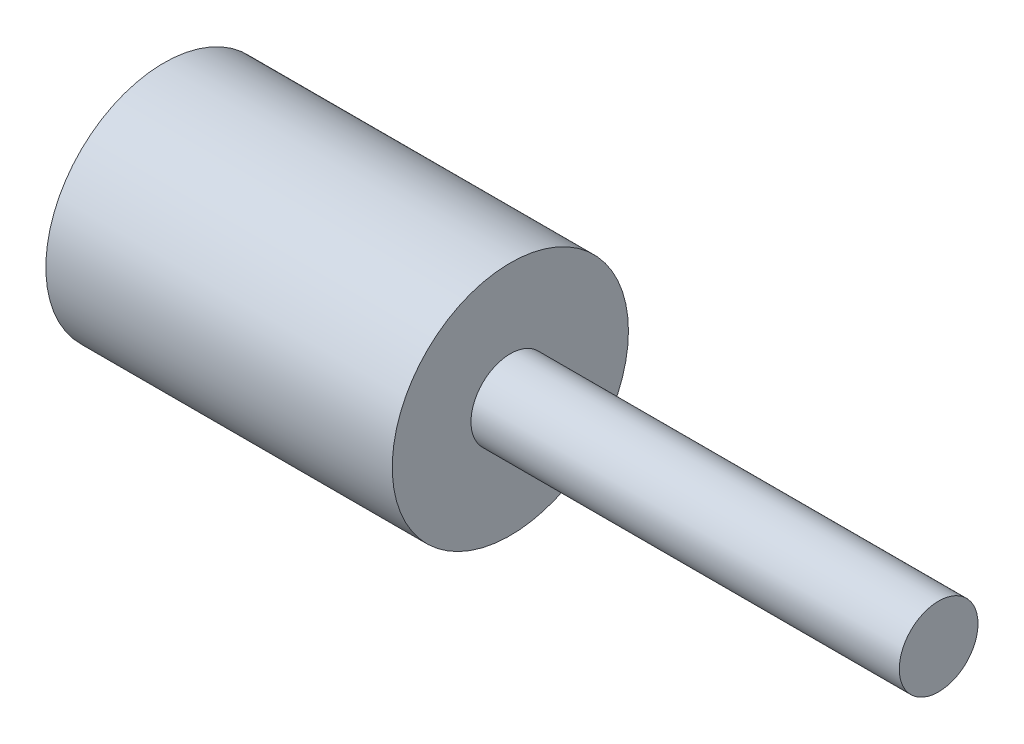
ISO-10303-21;
HEADER;
FILE_DESCRIPTION(('STEP AP214'),'2;1');
FILE_NAME('part.step','',(''),(''),'','','');
FILE_SCHEMA(('AUTOMOTIVE_DESIGN { 1 0 10303 214 1 1 1 1 }'));
ENDSEC;
DATA;
#1=APPLICATION_CONTEXT('core data for automotive mechanical design processes');
#2=APPLICATION_PROTOCOL_DEFINITION('international standard','automotive_design',2000,#1);
#3=PRODUCT_CONTEXT('',#1,'mechanical');
#4=PRODUCT('Part','Part','',(#3));
#5=PRODUCT_RELATED_PRODUCT_CATEGORY('part','',(#4));
#6=PRODUCT_DEFINITION_FORMATION('','',#4);
#7=PRODUCT_DEFINITION_CONTEXT('part definition',#1,'design');
#8=PRODUCT_DEFINITION('design','',#6,#7);
#9=PRODUCT_DEFINITION_SHAPE('','',#8);
#10=(LENGTH_UNIT() NAMED_UNIT(*) SI_UNIT(.MILLI.,.METRE.));
#11=(NAMED_UNIT(*) PLANE_ANGLE_UNIT() SI_UNIT($,.RADIAN.));
#12=(NAMED_UNIT(*) SI_UNIT($,.STERADIAN.) SOLID_ANGLE_UNIT());
#13=UNCERTAINTY_MEASURE_WITH_UNIT(LENGTH_MEASURE(1.E-05),#10,'distance_accuracy_value','');
#14=(GEOMETRIC_REPRESENTATION_CONTEXT(3) GLOBAL_UNCERTAINTY_ASSIGNED_CONTEXT((#13)) GLOBAL_UNIT_ASSIGNED_CONTEXT((#10,
#11,#12)) REPRESENTATION_CONTEXT('',''));
#15=CARTESIAN_POINT('',(0.,0.,0.));
#16=DIRECTION('',(0.,0.,1.));
#17=DIRECTION('',(1.,0.,0.));
#18=AXIS2_PLACEMENT_3D('',#15,#16,#17);
#19=CARTESIAN_POINT('',(0.,0.,0.));
#20=DIRECTION('',(1.,0.,0.));
#21=DIRECTION('',(0.,0.,-1.));
#22=AXIS2_PLACEMENT_3D('',#19,#20,#21);
#23=PLANE('',#22);
#24=CARTESIAN_POINT('',(0.,0.,0.));
#25=DIRECTION('',(-1.,0.,0.));
#26=DIRECTION('',(0.,0.,1.));
#27=AXIS2_PLACEMENT_3D('',#24,#25,#26);
#28=CIRCLE('',#27,3.75);
#29=CARTESIAN_POINT('',(0.,0.,3.75));
#30=VERTEX_POINT('',#29);
#31=EDGE_CURVE('E99',#30,#30,#28,.T.);
#32=ORIENTED_EDGE('',*,*,#31,.F.);
#33=EDGE_LOOP('',(#32));
#34=FACE_BOUND('',#33,.T.);
#35=CARTESIAN_POINT('',(0.,0.,0.));
#36=DIRECTION('',(1.,0.,0.));
#37=DIRECTION('',(0.,0.,-1.));
#38=AXIS2_PLACEMENT_3D('',#35,#36,#37);
#39=CIRCLE('',#38,7.5);
#40=CARTESIAN_POINT('',(0.,0.,-7.5));
#41=VERTEX_POINT('',#40);
#42=EDGE_CURVE('E58',#41,#41,#39,.T.);
#43=ORIENTED_EDGE('',*,*,#42,.F.);
#44=EDGE_LOOP('',(#43));
#45=FACE_BOUND('',#44,.T.);
#46=ADVANCED_FACE('F41',(#34,#45),#23,.F.);
#47=CARTESIAN_POINT('',(49.2,0.,0.));
#48=DIRECTION('',(1.,0.,0.));
#49=DIRECTION('',(0.,0.,-1.));
#50=AXIS2_PLACEMENT_3D('',#47,#48,#49);
#51=CYLINDRICAL_SURFACE('',#50,7.5);
#52=CARTESIAN_POINT('',(3.46134987512084,0.403773083988441,-6.97926672960183));
#53=CARTESIAN_POINT('',(3.47152983620495,0.440195317517897,-7.4883245853202));
#54=CARTESIAN_POINT('',(2.97980521968072,0.576818691412058,-7.47778578171625));
#55=CARTESIAN_POINT('',(3.43877449700653,0.323001466650791,-6.98757373392537));
#56=CARTESIAN_POINT('',(3.44506887639352,0.353339285616381,-7.49291141332811));
#57=CARTESIAN_POINT('',(2.9497047155297,0.46143066664979,-7.48668614352733));
#58=CARTESIAN_POINT('',(3.42295612892248,0.240203439208041,-6.99355934643733));
#59=CARTESIAN_POINT('',(3.42617985694261,0.262924802296811,-7.49632916883528));
#60=CARTESIAN_POINT('',(2.9286135580812,0.343147770298765,-7.49309929975168));
#61=CARTESIAN_POINT('',(3.405407400726,0.0730157462910324,-7.00021029863759));
#62=CARTESIAN_POINT('',(3.40532558215163,0.080196448081362,-7.50011196833271));
#63=CARTESIAN_POINT('',(2.90521525381891,0.104308208985412,-7.5002253199502));
#64=CARTESIAN_POINT('',(3.40367407032254,-0.0113735798432147,-7.00087676004241));
#65=CARTESIAN_POINT('',(3.40324494178492,-0.0125971332762231,-7.5004978816679));
#66=CARTESIAN_POINT('',(2.90290414661708,-0.0162479712054712,-7.50093938576348));
#67=CARTESIAN_POINT('',(3.41418347331524,-0.176539193620047,-6.99688149083974));
#68=CARTESIAN_POINT('',(3.4157449882851,-0.193342811341342,-7.49821980810748));
#69=CARTESIAN_POINT('',(2.91691668393919,-0.252198848027788,-7.4966587401818));
#70=CARTESIAN_POINT('',(3.42599080862015,-0.25734593662656,-6.99238574454701));
#71=CARTESIAN_POINT('',(3.42986984563603,-0.281816449608304,-7.49563928331543));
#72=CARTESIAN_POINT('',(2.93265979767499,-0.367637052321973,-7.49184186912569));
#73=CARTESIAN_POINT('',(3.4624664732951,-0.41577139007139,-6.9788172142623));
#74=CARTESIAN_POINT('',(3.4729569622573,-0.453658648730667,-7.48804426222132));
#75=CARTESIAN_POINT('',(2.98129401724354,-0.593959128674158,-7.47730415812591));
#76=CARTESIAN_POINT('',(3.48713529218839,-0.493389979043487,-6.96974425605665));
#77=CARTESIAN_POINT('',(3.5021241894842,-0.537397046841379,-7.48299489941553));
#78=CARTESIAN_POINT('',(3.01418577577395,-0.704842827208989,-7.46758313152475));
#79=CARTESIAN_POINT('',(3.54872182715635,-0.643804100672505,-6.94790496305974));
#80=CARTESIAN_POINT('',(3.57375522146097,-0.697415192570807,-7.47126581270006));
#81=CARTESIAN_POINT('',(3.0963011557249,-0.919720143813833,-7.44418388895689));
#82=CARTESIAN_POINT('',(3.58570908252885,-0.716569370910425,-6.93511771419894));
#83=CARTESIAN_POINT('',(3.6165870463601,-0.773871949250063,-7.46453532131574));
#84=CARTESIAN_POINT('',(3.14561749620911,-1.02367052985662,-7.4304832650576));
#85=CARTESIAN_POINT('',(3.67089938400283,-0.855098312739958,-6.90715960251651));
#86=CARTESIAN_POINT('',(3.71322425922761,-0.916708407017081,-7.45050184454463));
#87=CARTESIAN_POINT('',(3.25920456484105,-1.22156901819701,-7.40052814545155));
#88=CARTESIAN_POINT('',(3.71912356339666,-0.920848446989794,-6.89198426609542));
#89=CARTESIAN_POINT('',(3.76735234554158,-0.983112925473451,-7.44316955398783));
#90=CARTESIAN_POINT('',(3.32350347071197,-1.315497781435,-7.38426885660307));
#91=CARTESIAN_POINT('',(3.82736545152009,-1.04577668187678,-6.86026101019536));
#92=CARTESIAN_POINT('',(3.88588659677426,-1.10636636122893,-7.42874030796069));
#93=CARTESIAN_POINT('',(3.46782598821636,-1.49396668837366,-7.35027965370595));
#94=CARTESIAN_POINT('',(3.88773641751494,-1.10464480333838,-6.84368365641372));
#95=CARTESIAN_POINT('',(3.95079005915509,-1.16262007831212,-7.42166449524396));
#96=CARTESIAN_POINT('',(3.54832060953615,-1.5780640046775,-7.33251820288693));
#97=CARTESIAN_POINT('',(4.01744533019716,-1.21142242713965,-6.81148761163437));
#98=CARTESIAN_POINT('',(4.08612301138476,-1.26178375653622,-7.4089424163596));
#99=CARTESIAN_POINT('',(3.7212658264439,-1.73060346727782,-7.29802244071021));
#100=CARTESIAN_POINT('',(4.08676781278456,-1.25935044267418,-6.79586733431742));
#101=CARTESIAN_POINT('',(4.15660715794053,-1.30442909767297,-7.40332515297504));
#102=CARTESIAN_POINT('',(3.81369580323187,-1.79907206099525,-7.28128642972347));
#103=CARTESIAN_POINT('',(4.23369485141015,-1.34361210105492,-6.76712719198057));
#104=CARTESIAN_POINT('',(4.30138111605005,-1.37724618441168,-7.3938521886502));
#105=CARTESIAN_POINT('',(4.0095985214003,-1.91944585861732,-7.2504934198802));
#106=CARTESIAN_POINT('',(4.3113988109308,-1.3797800232983,-6.75404403400623));
#107=CARTESIAN_POINT('',(4.37552052664015,-1.40687969789514,-7.39007097161584));
#108=CARTESIAN_POINT('',(4.11320380075726,-1.97111431880011,-7.23647574998684));
#109=CARTESIAN_POINT('',(4.47213244157208,-1.43843191179064,-6.73225726297903));
#110=CARTESIAN_POINT('',(4.52463366294648,-1.45383857106162,-7.38426960936252));
#111=CARTESIAN_POINT('',(4.32751530827815,-2.05490273098916,-7.21313278120466));
#112=CARTESIAN_POINT('',(4.55516066276566,-1.46091958616028,-6.7235524632544));
#113=CARTESIAN_POINT('',(4.59921153608436,-1.47086412896918,-7.38228985281925));
#114=CARTESIAN_POINT('',(4.438219603206,-2.08702798031057,-7.20380621088142));
#115=CARTESIAN_POINT('',(4.72139737196173,-1.4909177676606,-6.7118340687022));
#116=CARTESIAN_POINT('',(4.74616230808021,-1.49343890783981,-7.37972369281712));
#117=CARTESIAN_POINT('',(4.65986854880302,-2.1298825251504,-7.19125078765142));
#118=CARTESIAN_POINT('',(4.80451808622033,-1.498877016215,-6.70865011357494));
#119=CARTESIAN_POINT('',(4.81804757427088,-1.49917566025195,-7.37911387962899));
#120=CARTESIAN_POINT('',(4.77069616781381,-2.14125287986435,-7.1878394059179));
#121=CARTESIAN_POINT('',(4.97093622632783,-1.50090077130773,-6.70784608547526));
#122=CARTESIAN_POINT('',(4.96231307288287,-1.50066177437418,-7.37895240145396));
#123=CARTESIAN_POINT('',(4.99258702128962,-2.14414395856475,-7.18697794722466));
#124=CARTESIAN_POINT('',(5.05423362190804,-1.49496749170627,-6.71022512600501));
#125=CARTESIAN_POINT('',(5.03415482641791,-1.4964017987924,-7.37940174077361));
#126=CARTESIAN_POINT('',(5.10365021539641,-2.13566784520851,-7.18952692044548));
#127=CARTESIAN_POINT('',(5.21629934966673,-1.46977915416084,-6.72010723018086));
#128=CARTESIAN_POINT('',(5.17674848576788,-1.4775573057072,-7.38152146207214));
#129=CARTESIAN_POINT('',(5.31973785240914,-2.09968450602789,-7.20011488974631));
#130=CARTESIAN_POINT('',(5.29512923543433,-1.45088587330038,-6.72747107189395));
#131=CARTESIAN_POINT('',(5.24699451894075,-1.46338099767762,-7.383143980374));
#132=CARTESIAN_POINT('',(5.42484436676723,-2.07269410462302,-7.20800471951987));
#133=CARTESIAN_POINT('',(5.44847713787974,-1.40078895931244,-6.74631916672708));
#134=CARTESIAN_POINT('',(5.38768175528546,-1.42384190152081,-7.38795049900001));
#135=CARTESIAN_POINT('',(5.62930823669397,-2.00112708462114,-7.22819910681827));
#136=CARTESIAN_POINT('',(5.52299464586162,-1.36958387724292,-6.75780390480966));
#137=CARTESIAN_POINT('',(5.45776187012501,-1.39871359056947,-7.39110358663529));
#138=CARTESIAN_POINT('',(5.72866491400138,-1.95654839610699,-7.24050418394598));
#139=CARTESIAN_POINT('',(5.66732242836437,-1.29502786636653,-6.78389102394226));
#140=CARTESIAN_POINT('',(5.59771901818369,-1.33557060970359,-7.39925478374181));
#141=CARTESIAN_POINT('',(5.92110195733916,-1.85003980904843,-7.26845466828365));
#142=CARTESIAN_POINT('',(5.73700393338249,-1.25143972647923,-6.79855281536143));
#143=CARTESIAN_POINT('',(5.66737951219626,-1.29759992619566,-7.404247966099));
#144=CARTESIAN_POINT('',(6.01401063069929,-1.78777103752356,-7.28416372942589));
#145=CARTESIAN_POINT('',(5.86823857976657,-1.15358945930719,-6.82925109369181));
#146=CARTESIAN_POINT('',(5.80217796990056,-1.20849643263408,-7.41581114985628));
#147=CARTESIAN_POINT('',(6.1889901592106,-1.64798494154493,-7.31705474186557));
#148=CARTESIAN_POINT('',(5.92978965933615,-1.09932463317136,-6.84528792760657));
#149=CARTESIAN_POINT('',(5.86731448779159,-1.15765083799326,-7.4223462050117));
#150=CARTESIAN_POINT('',(6.27105826529993,-1.57046376158976,-7.33423706495304));
#151=CARTESIAN_POINT('',(6.04530535918744,-0.979350109426314,-6.87762821964431));
#152=CARTESIAN_POINT('',(5.99200450972688,-1.04137965426748,-7.4364799225086));
#153=CARTESIAN_POINT('',(6.42507919843745,-1.39907158498134,-7.36888737854225));
#154=CARTESIAN_POINT('',(6.09891816253803,-0.913299392863548,-6.89392057116443));
#155=CARTESIAN_POINT('',(6.05151261565454,-0.975656026539498,-7.44410262222523));
#156=CARTESIAN_POINT('',(6.49656293624449,-1.30471341838311,-7.38634346906142));
#157=CARTESIAN_POINT('',(6.19431639396918,-0.772913732750899,-6.92437231629141));
#158=CARTESIAN_POINT('',(6.15877226489862,-0.832496558526676,-7.45902012866418));
#159=CARTESIAN_POINT('',(6.62376057815099,-1.1041624753177,-7.41897033865764));
#160=CARTESIAN_POINT('',(6.23610584823674,-0.698581621298607,-6.93853243521396));
#161=CARTESIAN_POINT('',(6.20685633210501,-0.755071577931056,-7.46633949350619));
#162=CARTESIAN_POINT('',(6.6794798504998,-0.997973744704204,-7.43414189485844));
#163=CARTESIAN_POINT('',(6.30322393981883,-0.551042933543503,-6.96197074265609));
#164=CARTESIAN_POINT('',(6.28457929780659,-0.599004858949693,-7.47876683936898));
#165=CARTESIAN_POINT('',(6.76897063927997,-0.78720419078375,-7.45925436714389));
#166=CARTESIAN_POINT('',(6.32974320984513,-0.478406418422231,-6.97158594877815));
#167=CARTESIAN_POINT('',(6.31577086653685,-0.521104985025631,-7.48404863560761));
#168=CARTESIAN_POINT('',(6.80432966599185,-0.683437740597744,-7.46955637355303));
#169=CARTESIAN_POINT('',(6.37133210857514,-0.329713047905585,-6.9868885260037));
#170=CARTESIAN_POINT('',(6.36472544629955,-0.360530222381673,-7.49253476525729));
#171=CARTESIAN_POINT('',(6.85978153096591,-0.471018639854545,-7.48595199198059));
#172=CARTESIAN_POINT('',(6.38640503626451,-0.253657184709832,-6.99257702879144));
#173=CARTESIAN_POINT('',(6.3826947089233,-0.277570457823199,-7.49577284357025));
#174=CARTESIAN_POINT('',(6.87987876787563,-0.362367406725377,-7.49204681651777));
#175=CARTESIAN_POINT('',(6.40516089149755,-0.095646649482302,-6.9996751084977));
#176=CARTESIAN_POINT('',(6.40496992958709,-0.10498487274874,-7.49980439783524));
#177=CARTESIAN_POINT('',(6.90488657484614,-0.136638070692125,-7.49965190200882));
#178=CARTESIAN_POINT('',(6.40815028880822,-0.0136018723438183,-7.0008240607918));
#179=CARTESIAN_POINT('',(6.40855797944524,-0.014804999726994,-7.50046947879871));
#180=CARTESIAN_POINT('',(6.90887243793031,-0.0194312462064873,-7.50088292228468));
#181=CARTESIAN_POINT('',(6.40072242656992,0.14983779665546,-6.99799746258956));
#182=CARTESIAN_POINT('',(6.39971953420929,0.164123160015132,-7.49885623836998));
#183=CARTESIAN_POINT('',(6.89896862161381,0.214053995223092,-7.49785442419051));
#184=CARTESIAN_POINT('',(6.39030253782012,0.231232557916645,-6.99402090711857));
#185=CARTESIAN_POINT('',(6.38724447577014,0.253328727982139,-7.49656902008685));
#186=CARTESIAN_POINT('',(6.88507543661204,0.330332225596162,-7.49359382906195));
#187=CARTESIAN_POINT('',(6.35643461043415,0.390963704597379,-6.98137791030673));
#188=CARTESIAN_POINT('',(6.34719256790881,0.426835318892558,-7.48947073031346));
#189=CARTESIAN_POINT('',(6.83991820009952,0.558519577995302,-7.48004776103661));
#190=CARTESIAN_POINT('',(6.33299852210559,0.46930282492906,-6.97271577103859));
#191=CARTESIAN_POINT('',(6.3194359292793,0.511527777056255,-7.48462863590922));
#192=CARTESIAN_POINT('',(6.80867008233226,0.670432607038705,-7.4707668975035));
#193=CARTESIAN_POINT('',(6.27386883209658,0.620897077805399,-6.95161715450192));
#194=CARTESIAN_POINT('',(6.25052566949979,0.673204156691916,-7.47323623028241));
#195=CARTESIAN_POINT('',(6.7298304956522,0.886995825437211,-7.44816123695));
#196=CARTESIAN_POINT('',(6.23817380354004,0.694151617337956,-6.93918023788879));
#197=CARTESIAN_POINT('',(6.20908221341455,0.75043148897809,-7.4666436538453));
#198=CARTESIAN_POINT('',(6.68223712423797,0.991645167632169,-7.43483596920326));
#199=CARTESIAN_POINT('',(6.15487207880235,0.834912543342262,-6.91157758280352));
#200=CARTESIAN_POINT('',(6.11428602015337,0.896144022990652,-7.45267045273865));
#201=CARTESIAN_POINT('',(6.57116815792445,1.19273220476803,-7.4052616958236));
#202=CARTESIAN_POINT('',(6.10707514025101,0.902301531469412,-6.89636946697742));
#203=CARTESIAN_POINT('',(6.06043956694273,0.964510056610677,-7.44524845827971));
#204=CARTESIAN_POINT('',(6.50743890653184,1.28900218778767,-7.3889672858798));
#205=CARTESIAN_POINT('',(6.00107562919479,1.02838313066046,-6.86492612961224));
#206=CARTESIAN_POINT('',(5.94396125604524,1.08944636818923,-7.43079901014567));
#207=CARTESIAN_POINT('',(6.36610622512262,1.46911875809428,-7.35527799598452));
#208=CARTESIAN_POINT('',(5.942853460291,1.08705897687362,-6.84868901164034));
#209=CARTESIAN_POINT('',(5.88107241181672,1.14587177978595,-7.42376909386538));
#210=CARTESIAN_POINT('',(6.2884766665741,1.55294139559461,-7.33788108414149));
#211=CARTESIAN_POINT('',(5.81552761293025,1.19580797751441,-6.81641800998019));
#212=CARTESIAN_POINT('',(5.74742740309236,1.24761933038846,-7.4107939512927));
#213=CARTESIAN_POINT('',(6.11870887009345,1.70829711067209,-7.30330501044433));
#214=CARTESIAN_POINT('',(5.74613897379631,1.24555198729488,-6.80040663334589));
#215=CARTESIAN_POINT('',(5.67643879960561,1.2922218849899,-7.40492311490899));
#216=CARTESIAN_POINT('',(6.02619068459268,1.77935998160318,-7.28614996325818));
#217=CARTESIAN_POINT('',(5.59983463744265,1.3325918882926,-6.77101262654863));
#218=CARTESIAN_POINT('',(5.53147254683339,1.3679747517278,-7.39505061369276));
#219=CARTESIAN_POINT('',(5.83111823612249,1.90370269737297,-7.25465638474262));
#220=CARTESIAN_POINT('',(5.52293344402584,1.36991117566484,-6.7576250754243));
#221=CARTESIAN_POINT('',(5.45764742132273,1.39879889490985,-7.39109336118354));
#222=CARTESIAN_POINT('',(5.728583311557,1.95701596528944,-7.24031258095124));
#223=CARTESIAN_POINT('',(5.36424416676344,1.4307894739841,-6.73515988184305));
#224=CARTESIAN_POINT('',(5.30962330180038,1.44787899318086,-7.38498666646117));
#225=CARTESIAN_POINT('',(5.5169976085346,2.04398496278091,-7.21624273040777));
#226=CARTESIAN_POINT('',(5.28250108302531,1.45445828936135,-6.72604796023789));
#227=CARTESIAN_POINT('',(5.23579056163188,1.46593415780733,-7.38286373295237));
#228=CARTESIAN_POINT('',(5.40800683022087,2.07779755583249,-7.20647995601513));
#229=CARTESIAN_POINT('',(5.11597090335959,1.48765195750029,-6.71313107111684));
#230=CARTESIAN_POINT('',(5.08797051446145,1.49105097546566,-7.37998402983609));
#231=CARTESIAN_POINT('',(5.18596659066847,2.12521708175815,-7.19264043197298));
#232=CARTESIAN_POINT('',(5.03118472483841,1.49718103691142,-6.7093245177411));
#233=CARTESIAN_POINT('',(5.01449818155861,1.4979336301507,-7.37924866069997));
#234=CARTESIAN_POINT('',(5.07291835263835,2.13883005270265,-7.18856198318716));
#235=CARTESIAN_POINT('',(4.86441796828901,1.5016546292142,-6.70754611404688));
#236=CARTESIAN_POINT('',(4.86987943722958,1.50121424359729,-7.3788924346538));
#237=CARTESIAN_POINT('',(4.85056267723745,2.14522089890431,-7.18665655086734));
#238=CARTESIAN_POINT('',(4.78245266042651,1.49713749932653,-6.70935888039265));
#239=CARTESIAN_POINT('',(4.79926797746296,1.4979752216939,-7.37923302124946));
#240=CARTESIAN_POINT('',(4.74127560008755,2.13876785592975,-7.18859879955921));
#241=CARTESIAN_POINT('',(4.62050890066015,1.47485072277891,-6.7181277570376));
#242=CARTESIAN_POINT('',(4.65723406700027,1.48137265993141,-7.38108729201014));
#243=CARTESIAN_POINT('',(4.52535058706632,2.10692960367136,-7.19799402437345));
#244=CARTESIAN_POINT('',(4.54053043061451,1.45708119717238,-6.72508382035557));
#245=CARTESIAN_POINT('',(4.58629751090624,1.46812417347889,-7.38258788045781));
#246=CARTESIAN_POINT('',(4.41871262700593,2.08154456732099,-7.20544695015878));
#247=CARTESIAN_POINT('',(4.38528556798001,1.40905477872059,-6.74325037872784));
#248=CARTESIAN_POINT('',(4.44456372903451,1.43045336213842,-7.3871326870392));
#249=CARTESIAN_POINT('',(4.21171947682598,2.01293539823995,-7.22491112028632));
#250=CARTESIAN_POINT('',(4.30999228850708,1.3788785518485,-6.75443335401394));
#251=CARTESIAN_POINT('',(4.37415380256314,1.40633454179025,-7.39013679017248));
#252=CARTESIAN_POINT('',(4.11132843752768,1.9698265026159,-7.23689287916998));
#253=CARTESIAN_POINT('',(4.16545917695036,1.3069591948707,-6.77980475037368));
#254=CARTESIAN_POINT('',(4.23473441189285,1.34583289628075,-7.3979178058241));
#255=CARTESIAN_POINT('',(3.91861762211881,1.86708456406708,-7.26407651814472));
#256=CARTESIAN_POINT('',(4.09622052845185,1.2652138097964,-6.79399375723204));
#257=CARTESIAN_POINT('',(4.16594062957897,1.3097425955795,-7.40265407500552));
#258=CARTESIAN_POINT('',(3.82629942412196,1.80744829975866,-7.27927902586241));
#259=CARTESIAN_POINT('',(3.96314981915323,1.1696189413246,-6.82439850494452));
#260=CARTESIAN_POINT('',(4.03010593061681,1.2233658355142,-7.41389441103495));
#261=CARTESIAN_POINT('',(3.64887181172401,1.67088420184103,-7.31185554074632));
#262=CARTESIAN_POINT('',(3.89959277817712,1.11539608315876,-6.84066789773098));
#263=CARTESIAN_POINT('',(3.96319107819176,1.17290634350346,-7.42041967902785));
#264=CARTESIAN_POINT('',(3.56412909042151,1.59342297569611,-7.32928703208105));
#265=CARTESIAN_POINT('',(3.7823244860172,0.997158108817584,-6.87304720449928));
#266=CARTESIAN_POINT('',(3.83709017082043,1.05887101263225,-7.43440702104536));
#267=CARTESIAN_POINT('',(3.40777136754251,1.42451158377193,-7.36397914644961));
#268=CARTESIAN_POINT('',(3.72861391002669,0.93314232167179,-6.88915710747295));
#269=CARTESIAN_POINT('',(3.77772844844825,0.995499782670459,-7.44185614685384));
#270=CARTESIAN_POINT('',(3.33615726622373,1.33306045946345,-7.38123975768911));
#271=CARTESIAN_POINT('',(3.63136096840456,0.795364181890176,-6.91984268499218));
#272=CARTESIAN_POINT('',(3.66880349059903,0.855670379961934,-7.45673432936426));
#273=CARTESIAN_POINT('',(3.20648667739043,1.1362345456266,-7.41411716281643));
#274=CARTESIAN_POINT('',(3.58807633320247,0.721413984048024,-6.9343753686438));
#275=CARTESIAN_POINT('',(3.61915052934727,0.778950685597143,-7.46418315855112));
#276=CARTESIAN_POINT('',(3.14877383044842,1.03059140579807,-7.42968789500504));
#277=CARTESIAN_POINT('',(3.51462130479832,0.566939936672599,-6.9598372829941));
#278=CARTESIAN_POINT('',(3.53434698266023,0.616126492957936,-7.47758846467587));
#279=CARTESIAN_POINT('',(3.05083379257647,0.809914195224183,-7.45696851734251));
#280=CARTESIAN_POINT('',(3.4844486206546,0.486417238420153,-6.97076714310339));
#281=CARTESIAN_POINT('',(3.49883689468853,0.529828602163946,-7.48359109184306));
#282=CARTESIAN_POINT('',(3.01060354705765,0.694881769165711,-7.46867908185981));
#283=CARTESIAN_POINT('',(3.46134987512084,0.403773083988441,-6.97926672960183));
#284=CARTESIAN_POINT('',(3.47152983620495,0.440195317517897,-7.4883245853202));
#285=CARTESIAN_POINT('',(2.97980521968072,0.576818691412058,-7.47778578171625));
#286=(BOUNDED_SURFACE() B_SPLINE_SURFACE(3,2,((#52,#53,#54),(#55,#56,#57),(#58,#59,#60),(#61,
#62,#63),(#64,#65,#66),(#67,#68,#69),(#70,#71,#72),(#73,#74,#75),(#76,#77,#78),(#79,#80,#81),
(#82,#83,#84),(#85,#86,#87),(#88,#89,#90),(#91,#92,#93),(#94,#95,#96),(#97,#98,#99),(#100,#101,
#102),(#103,#104,#105),(#106,#107,#108),(#109,#110,#111),(#112,#113,#114),(#115,#116,#117),
(#118,#119,#120),(#121,#122,#123),(#124,#125,#126),(#127,#128,#129),(#130,#131,#132),(#133,#134,
#135),(#136,#137,#138),(#139,#140,#141),(#142,#143,#144),(#145,#146,#147),(#148,#149,#150),
(#151,#152,#153),(#154,#155,#156),(#157,#158,#159),(#160,#161,#162),(#163,#164,#165),(#166,#167,
#168),(#169,#170,#171),(#172,#173,#174),(#175,#176,#177),(#178,#179,#180),(#181,#182,#183),
(#184,#185,#186),(#187,#188,#189),(#190,#191,#192),(#193,#194,#195),(#196,#197,#198),(#199,#200,
#201),(#202,#203,#204),(#205,#206,#207),(#208,#209,#210),(#211,#212,#213),(#214,#215,#216),
(#217,#218,#219),(#220,#221,#222),(#223,#224,#225),(#226,#227,#228),(#229,#230,#231),(#232,#233,
#234),(#235,#236,#237),(#238,#239,#240),(#241,#242,#243),(#244,#245,#246),(#247,#248,#249),
(#250,#251,#252),(#253,#254,#255),(#256,#257,#258),(#259,#260,#261),(#262,#263,#264),(#265,#266,
#267),(#268,#269,#270),(#271,#272,#273),(#274,#275,#276),(#277,#278,#279),(#280,#281,#282),
(#283,#284,#285)),.UNSPECIFIED.,.T.,.F.,.F.) B_SPLINE_SURFACE_WITH_KNOTS((4,2,2,2,2,2,2,2,2,2,2,
2,2,2,2,2,2,2,2,2,2,2,2,2,2,2,2,2,2,2,2,2,2,2,2,2,2,2,4),(3,3),(0.,0.335972677373809,
0.671874502077117,0.997271188304442,1.32268026041788,1.64995836105771,1.97785701393945,
2.31721492163881,2.65599422787945,2.99935918892728,3.34263103713858,3.67510819733212,
4.00753237884177,4.33103560394491,4.65457691261468,4.98479058563269,5.31508783750179,
5.6572464854281,5.99928847796977,6.30867534354598,6.61797300590094,6.94479035813444,
7.27167180023674,7.59825362403425,7.92487347312605,8.2569866621099,8.58973080902533,
8.93295473940566,9.27552866351924,9.61530704109764,9.9549838316588,10.2818042734196,
10.6086217298902,10.9333470667057,11.2581357409776,11.5943227859018,11.9305328752789,
12.2743545406397,12.6181161087366),(0.,1.),
.UNSPECIFIED.) GEOMETRIC_REPRESENTATION_ITEM() RATIONAL_B_SPLINE_SURFACE(((1.,0.699749038761322,
1.),(1.,0.702708213278115,1.),(1.,0.704827681155372,1.),(1.,0.707181890820702,1.),(1.,
0.707417029980992,1.),(1.,0.706003797529279,1.),(1.,0.704414101657895,1.),(1.,0.699591801296326,
1.),(1.,0.696359134272836,1.),(1.,0.688520434209467,1.),(1.,0.683906619709923,1.),(1.,
0.673725790179998,1.),(1.,0.668156984372981,1.),(1.,0.656394834618455,1.),(1.,0.650186465949436,
1.),(1.,0.637997504153692,1.),(1.,0.632016540719849,1.),(1.,0.62090605341366,1.),(1.,
0.615789150293951,1.),(1.,0.607209544849037,1.),(1.,0.603746394318152,1.),(1.,0.599071886402445,
1.),(1.,0.597793142713117,1.),(1.,0.59747087744571,1.),(1.,0.598426999727887,1.),(1.,
0.602373740628683,1.),(1.,0.605309072799963,1.),(1.,0.612754721166151,1.),(1.,0.617265222731234,
1.),(1.,0.627401994853102,1.),(1.,0.633049357480188,1.),(1.,0.644742254655258,1.),(1.,
0.650787889620908,1.),(1.,0.662855199594238,1.),(1.,0.668868217598646,1.),(1.,0.680009865316591,
1.),(1.,0.685138795854043,1.),(1.,0.693576847723799,1.),(1.,0.69701295942503,1.),(1.,
0.702464106863337,1.),(1.,0.704479552043066,1.),(1.,0.706992834223862,1.),(1.,0.707398242127431,
1.),(1.,0.706398621980515,1.),(1.,0.704993238882486,1.),(1.,0.700503268613822,1.),(1.,
0.697420221776077,1.),(1.,0.689856754106516,1.),(1.,0.685376170614368,1.),(1.,0.675341761729412,
1.),(1.,0.669771153167102,1.),(1.,0.658133432474402,1.),(1.,0.652065397178893,1.),(1.,
0.639875978003496,1.),(1.,0.633758933013168,1.),(1.,0.622417531233502,1.),(1.,0.617191505787637,
1.),(1.,0.608358600515998,1.),(1.,0.604738855798322,1.),(1.,0.599591618523584,1.),(1.,
0.598063500748056,1.),(1.,0.597350617193482,1.),(1.,0.598079347496791,1.),(1.,0.6015842563818,
1.),(1.,0.604360416261342,1.),(1.,0.611546450289937,1.),(1.,0.615945752463985,1.),(1.,
0.625821436693709,1.),(1.,0.631298028665717,1.),(1.,0.642904921809186,1.),(1.,0.649051419538211,
1.),(1.,0.661155513983321,1.),(1.,0.667113097722018,1.),(1.,0.678361802612456,1.),(1.,
0.683634781988757,1.),(1.,0.692814392041374,1.),(1.,0.696721261383362,1.),(1.,0.699749038761322,1.))) REPRESENTATION_ITEM('') SURFACE());
#287=CARTESIAN_POINT('',(2.97980521968072,0.576818691412058,-7.47778578171625));
#288=CARTESIAN_POINT('',(2.9497047155297,0.46143066664979,-7.48668614352733));
#289=CARTESIAN_POINT('',(2.9286135580812,0.343147770298765,-7.49309929975168));
#290=CARTESIAN_POINT('',(2.90521525381891,0.104308208985412,-7.5002253199502));
#291=CARTESIAN_POINT('',(2.90290414661708,-0.0162479712054713,-7.50093938576348));
#292=CARTESIAN_POINT('',(2.91691668393919,-0.252198848027788,-7.4966587401818));
#293=CARTESIAN_POINT('',(2.93265979767499,-0.367637052321973,-7.49184186912569));
#294=CARTESIAN_POINT('',(2.98129401724354,-0.593959128674158,-7.47730415812591));
#295=CARTESIAN_POINT('',(3.01418577577395,-0.704842827208989,-7.46758313152475));
#296=CARTESIAN_POINT('',(3.0963011557249,-0.919720143813833,-7.44418388895689));
#297=CARTESIAN_POINT('',(3.14561749620911,-1.02367052985662,-7.4304832650576));
#298=CARTESIAN_POINT('',(3.25920456484105,-1.22156901819701,-7.40052814545155));
#299=CARTESIAN_POINT('',(3.32350347071197,-1.315497781435,-7.38426885660307));
#300=CARTESIAN_POINT('',(3.46782598821636,-1.49396668837366,-7.35027965370595));
#301=CARTESIAN_POINT('',(3.54832060953615,-1.5780640046775,-7.33251820288693));
#302=CARTESIAN_POINT('',(3.7212658264439,-1.73060346727782,-7.29802244071021));
#303=CARTESIAN_POINT('',(3.81369580323187,-1.79907206099525,-7.28128642972347));
#304=CARTESIAN_POINT('',(4.0095985214003,-1.91944585861732,-7.2504934198802));
#305=CARTESIAN_POINT('',(4.11320380075726,-1.97111431880011,-7.23647574998684));
#306=CARTESIAN_POINT('',(4.32751530827815,-2.05490273098916,-7.21313278120466));
#307=CARTESIAN_POINT('',(4.438219603206,-2.08702798031057,-7.20380621088142));
#308=CARTESIAN_POINT('',(4.65986854880302,-2.1298825251504,-7.19125078765143));
#309=CARTESIAN_POINT('',(4.77069616781381,-2.14125287986435,-7.1878394059179));
#310=CARTESIAN_POINT('',(4.99258702128962,-2.14414395856475,-7.18697794722466));
#311=CARTESIAN_POINT('',(5.10365021539641,-2.13566784520851,-7.18952692044548));
#312=CARTESIAN_POINT('',(5.31973785240914,-2.09968450602789,-7.20011488974631));
#313=CARTESIAN_POINT('',(5.42484436676723,-2.07269410462302,-7.20800471951987));
#314=CARTESIAN_POINT('',(5.62930823669397,-2.00112708462114,-7.22819910681827));
#315=CARTESIAN_POINT('',(5.72866491400138,-1.95654839610699,-7.24050418394598));
#316=CARTESIAN_POINT('',(5.92110195733916,-1.85003980904843,-7.26845466828365));
#317=CARTESIAN_POINT('',(6.01401063069929,-1.78777103752356,-7.28416372942589));
#318=CARTESIAN_POINT('',(6.1889901592106,-1.64798494154493,-7.31705474186557));
#319=CARTESIAN_POINT('',(6.27105826529993,-1.57046376158976,-7.33423706495304));
#320=CARTESIAN_POINT('',(6.42507919843745,-1.39907158498134,-7.36888737854225));
#321=CARTESIAN_POINT('',(6.49656293624449,-1.30471341838311,-7.38634346906142));
#322=CARTESIAN_POINT('',(6.62376057815099,-1.1041624753177,-7.41897033865764));
#323=CARTESIAN_POINT('',(6.6794798504998,-0.997973744704204,-7.43414189485844));
#324=CARTESIAN_POINT('',(6.76897063927997,-0.78720419078375,-7.45925436714389));
#325=CARTESIAN_POINT('',(6.80432966599185,-0.683437740597745,-7.46955637355302));
#326=CARTESIAN_POINT('',(6.85978153096591,-0.471018639854545,-7.48595199198059));
#327=CARTESIAN_POINT('',(6.87987876787563,-0.362367406725376,-7.49204681651777));
#328=CARTESIAN_POINT('',(6.90488657484614,-0.136638070692125,-7.49965190200882));
#329=CARTESIAN_POINT('',(6.90887243793031,-0.0194312462064875,-7.50088292228468));
#330=CARTESIAN_POINT('',(6.89896862161381,0.214053995223092,-7.49785442419051));
#331=CARTESIAN_POINT('',(6.88507543661204,0.330332225596163,-7.49359382906195));
#332=CARTESIAN_POINT('',(6.83991820009952,0.558519577995302,-7.48004776103661));
#333=CARTESIAN_POINT('',(6.80867008233226,0.670432607038705,-7.4707668975035));
#334=CARTESIAN_POINT('',(6.7298304956522,0.886995825437211,-7.44816123695));
#335=CARTESIAN_POINT('',(6.68223712423797,0.991645167632169,-7.43483596920326));
#336=CARTESIAN_POINT('',(6.57116815792445,1.19273220476803,-7.4052616958236));
#337=CARTESIAN_POINT('',(6.50743890653184,1.28900218778767,-7.3889672858798));
#338=CARTESIAN_POINT('',(6.36610622512262,1.46911875809428,-7.35527799598453));
#339=CARTESIAN_POINT('',(6.2884766665741,1.55294139559461,-7.33788108414149));
#340=CARTESIAN_POINT('',(6.11870887009345,1.70829711067209,-7.30330501044433));
#341=CARTESIAN_POINT('',(6.02619068459267,1.77935998160318,-7.28614996325818));
#342=CARTESIAN_POINT('',(5.83111823612249,1.90370269737297,-7.25465638474262));
#343=CARTESIAN_POINT('',(5.728583311557,1.95701596528944,-7.24031258095124));
#344=CARTESIAN_POINT('',(5.5169976085346,2.04398496278091,-7.21624273040777));
#345=CARTESIAN_POINT('',(5.40800683022087,2.07779755583249,-7.20647995601513));
#346=CARTESIAN_POINT('',(5.18596659066847,2.12521708175815,-7.19264043197298));
#347=CARTESIAN_POINT('',(5.07291835263835,2.13883005270265,-7.18856198318716));
#348=CARTESIAN_POINT('',(4.85056267723745,2.14522089890431,-7.18665655086734));
#349=CARTESIAN_POINT('',(4.74127560008755,2.13876785592975,-7.18859879955921));
#350=CARTESIAN_POINT('',(4.52535058706632,2.10692960367136,-7.19799402437345));
#351=CARTESIAN_POINT('',(4.41871262700593,2.08154456732099,-7.20544695015878));
#352=CARTESIAN_POINT('',(4.21171947682598,2.01293539823995,-7.22491112028632));
#353=CARTESIAN_POINT('',(4.11132843752768,1.9698265026159,-7.23689287916998));
#354=CARTESIAN_POINT('',(3.91861762211881,1.86708456406708,-7.26407651814472));
#355=CARTESIAN_POINT('',(3.82629942412196,1.80744829975866,-7.27927902586241));
#356=CARTESIAN_POINT('',(3.64887181172401,1.67088420184103,-7.31185554074632));
#357=CARTESIAN_POINT('',(3.56412909042151,1.59342297569611,-7.32928703208105));
#358=CARTESIAN_POINT('',(3.40777136754251,1.42451158377193,-7.36397914644961));
#359=CARTESIAN_POINT('',(3.33615726622373,1.33306045946345,-7.38123975768911));
#360=CARTESIAN_POINT('',(3.20648667739043,1.1362345456266,-7.41411716281643));
#361=CARTESIAN_POINT('',(3.14877383044842,1.03059140579807,-7.42968789500504));
#362=CARTESIAN_POINT('',(3.05083379257647,0.809914195224183,-7.45696851734251));
#363=CARTESIAN_POINT('',(3.01060354705765,0.694881769165711,-7.46867908185981));
#364=CARTESIAN_POINT('',(2.97980521968072,0.576818691412058,-7.47778578171625));
#365=B_SPLINE_CURVE_WITH_KNOTS('',3,(#287,#288,#289,#290,#291,#292,#293,#294,#295,#296,#297,
#298,#299,#300,#301,#302,#303,#304,#305,#306,#307,#308,#309,#310,#311,#312,#313,#314,#315,#316,
#317,#318,#319,#320,#321,#322,#323,#324,#325,#326,#327,#328,#329,#330,#331,#332,#333,#334,#335,
#336,#337,#338,#339,#340,#341,#342,#343,#344,#345,#346,#347,#348,#349,#350,#351,#352,#353,#354,
#355,#356,#357,#358,#359,#360,#361,#362,#363,#364),.UNSPECIFIED.,.T.,.F.,(4,2,2,2,2,2,2,2,2,2,2,
2,2,2,2,2,2,2,2,2,2,2,2,2,2,2,2,2,2,2,2,2,2,2,2,2,2,2,4),(0.,0.335972677373809,
0.671874502077117,0.997271188304442,1.32268026041788,1.64995836105771,1.97785701393945,
2.31721492163881,2.65599422787945,2.99935918892728,3.34263103713858,3.67510819733212,
4.00753237884177,4.33103560394491,4.65457691261468,4.98479058563269,5.31508783750179,
5.6572464854281,5.99928847796977,6.30867534354598,6.61797300590094,6.94479035813444,
7.27167180023674,7.59825362403425,7.92487347312605,8.2569866621099,8.58973080902533,
8.93295473940566,9.27552866351924,9.61530704109764,9.9549838316588,10.2818042734196,
10.6086217298902,10.9333470667057,11.2581357409776,11.5943227859018,11.9305328752789,
12.2743545406397,12.6181161087366),.UNSPECIFIED.);
#366=CARTESIAN_POINT('',(2.97980521968072,0.576818691412058,-7.47778578171625));
#367=VERTEX_POINT('',#366);
#368=EDGE_CURVE('E53',#367,#367,#365,.T.);
#369=ORIENTED_EDGE('',*,*,#368,.T.);
#370=EDGE_LOOP('',(#369));
#371=FACE_BOUND('',#370,.T.);
#372=CARTESIAN_POINT('',(22.,0.,0.));
#373=DIRECTION('',(1.,0.,0.));
#374=DIRECTION('',(0.,0.,-1.));
#375=AXIS2_PLACEMENT_3D('',#372,#373,#374);
#376=CIRCLE('',#375,7.5);
#377=CARTESIAN_POINT('',(22.,0.,-7.5));
#378=VERTEX_POINT('',#377);
#379=EDGE_CURVE('E104',#378,#378,#376,.T.);
#380=ORIENTED_EDGE('',*,*,#379,.F.);
#381=EDGE_LOOP('',(#380));
#382=FACE_BOUND('',#381,.T.);
#383=ORIENTED_EDGE('',*,*,#42,.T.);
#384=EDGE_LOOP('',(#383));
#385=FACE_BOUND('',#384,.T.);
#386=ADVANCED_FACE('F84',(#371,#382,#385),#51,.T.);
#387=CARTESIAN_POINT('',(22.,0.,-7.5));
#388=DIRECTION('',(-1.,0.,0.));
#389=DIRECTION('',(0.,0.,1.));
#390=AXIS2_PLACEMENT_3D('',#387,#388,#389);
#391=PLANE('',#390);
#392=CARTESIAN_POINT('',(22.,0.,0.));
#393=DIRECTION('',(1.,0.,0.));
#394=DIRECTION('',(0.,0.,-1.));
#395=AXIS2_PLACEMENT_3D('',#392,#393,#394);
#396=CIRCLE('',#395,2.5);
#397=CARTESIAN_POINT('',(22.,0.,-2.5));
#398=VERTEX_POINT('',#397);
#399=EDGE_CURVE('E108',#398,#398,#396,.T.);
#400=ORIENTED_EDGE('',*,*,#399,.F.);
#401=EDGE_LOOP('',(#400));
#402=FACE_BOUND('',#401,.T.);
#403=ORIENTED_EDGE('',*,*,#379,.T.);
#404=EDGE_LOOP('',(#403));
#405=FACE_BOUND('',#404,.T.);
#406=ADVANCED_FACE('F88',(#402,#405),#391,.F.);
#407=CARTESIAN_POINT('',(49.2,0.,0.));
#408=DIRECTION('',(1.,0.,0.));
#409=DIRECTION('',(0.,0.,-1.));
#410=AXIS2_PLACEMENT_3D('',#407,#408,#409);
#411=CYLINDRICAL_SURFACE('',#410,2.5);
#412=CARTESIAN_POINT('',(49.2,0.,0.));
#413=DIRECTION('',(1.,0.,0.));
#414=DIRECTION('',(0.,0.,-1.));
#415=AXIS2_PLACEMENT_3D('',#412,#413,#414);
#416=CIRCLE('',#415,2.5);
#417=CARTESIAN_POINT('',(49.2,0.,-2.5));
#418=VERTEX_POINT('',#417);
#419=EDGE_CURVE('E137',#418,#418,#416,.T.);
#420=ORIENTED_EDGE('',*,*,#419,.F.);
#421=EDGE_LOOP('',(#420));
#422=FACE_BOUND('',#421,.T.);
#423=ORIENTED_EDGE('',*,*,#399,.T.);
#424=EDGE_LOOP('',(#423));
#425=FACE_BOUND('',#424,.T.);
#426=ADVANCED_FACE('F126',(#422,#425),#411,.T.);
#427=CARTESIAN_POINT('',(49.2,0.,-2.5));
#428=DIRECTION('',(-1.,0.,0.));
#429=DIRECTION('',(0.,0.,1.));
#430=AXIS2_PLACEMENT_3D('',#427,#428,#429);
#431=PLANE('',#430);
#432=ORIENTED_EDGE('',*,*,#419,.T.);
#433=EDGE_LOOP('',(#432));
#434=FACE_BOUND('',#433,.T.);
#435=ADVANCED_FACE('F123',(#434),#431,.F.);
#436=CARTESIAN_POINT('',(15.,0.,0.));
#437=DIRECTION('',(-1.,0.,0.));
#438=DIRECTION('',(0.,0.,1.));
#439=AXIS2_PLACEMENT_3D('',#436,#437,#438);
#440=CYLINDRICAL_SURFACE('',#439,3.75);
#441=CARTESIAN_POINT('',(6.40598384144119,0.,-3.75));
#442=CARTESIAN_POINT('',(6.40597645257339,-0.0806197540821685,-3.74999453420313));
#443=CARTESIAN_POINT('',(6.3994455273749,-0.161379423068005,-3.74736970730199));
#444=CARTESIAN_POINT('',(6.37354806380026,-0.320622360313422,-3.73712589825481));
#445=CARTESIAN_POINT('',(6.35414663212659,-0.399098833170936,-3.72949334024158));
#446=CARTESIAN_POINT('',(6.30332678289706,-0.551215442045552,-3.71005656909839));
#447=CARTESIAN_POINT('',(6.27194770677864,-0.624870496212719,-3.69826602273054));
#448=CARTESIAN_POINT('',(6.19821946144628,-0.765803977746275,-3.67167458097059));
#449=CARTESIAN_POINT('',(6.15587410025199,-0.833084607563244,-3.65687473093543));
#450=CARTESIAN_POINT('',(6.05930721752048,-0.962625755677795,-3.62498164627814));
#451=CARTESIAN_POINT('',(6.00465384926099,-1.02454670441266,-3.60781722696893));
#452=CARTESIAN_POINT('',(5.8859338388336,-1.13863125358854,-3.57345432679646));
#453=CARTESIAN_POINT('',(5.82186261853238,-1.19079008035015,-3.55625583340344));
#454=CARTESIAN_POINT('',(5.68266278875949,-1.28615592546966,-3.52292093847852));
#455=CARTESIAN_POINT('',(5.60716897692379,-1.3288612358966,-3.50686586973714));
#456=CARTESIAN_POINT('',(5.44933154262615,-1.40081603927786,-3.47875235390095));
#457=CARTESIAN_POINT('',(5.36699119555492,-1.43007192321438,-3.46669200933132));
#458=CARTESIAN_POINT('',(5.20169959124711,-1.4729241175469,-3.44869768245614));
#459=CARTESIAN_POINT('',(5.11894541475903,-1.48717047435424,-3.44251065266704));
#460=CARTESIAN_POINT('',(4.95200759271074,-1.50162972123002,-3.43623003036858));
#461=CARTESIAN_POINT('',(4.86782467047243,-1.50184951223492,-3.43613344142076));
#462=CARTESIAN_POINT('',(4.70666633784765,-1.48874202562841,-3.44182875209996));
#463=CARTESIAN_POINT('',(4.62959705563441,-1.47635648572885,-3.44721131278838));
#464=CARTESIAN_POINT('',(4.47873917443615,-1.43996016022336,-3.46257140705877));
#465=CARTESIAN_POINT('',(4.40495115035846,-1.41594734610347,-3.47254974241255));
#466=CARTESIAN_POINT('',(4.26097046429416,-1.3565210494133,-3.49619613816398));
#467=CARTESIAN_POINT('',(4.19088191215017,-1.32088489673649,-3.50993534460591));
#468=CARTESIAN_POINT('',(4.05742197917001,-1.23937984554916,-3.53953587292417));
#469=CARTESIAN_POINT('',(3.99405313438908,-1.19350710382563,-3.55539799092636));
#470=CARTESIAN_POINT('',(3.87067654483969,-1.08866294959082,-3.58895052556703));
#471=CARTESIAN_POINT('',(3.81130729435668,-1.02895309722798,-3.60668748732114));
#472=CARTESIAN_POINT('',(3.70322048293966,-0.900235820572644,-3.64094868718711));
#473=CARTESIAN_POINT('',(3.65450504338347,-0.831226549000825,-3.65747268333994));
#474=CARTESIAN_POINT('',(3.56827075587931,-0.684058239454382,-3.68786010948411));
#475=CARTESIAN_POINT('',(3.5309921305434,-0.605745368509857,-3.70166452571561));
#476=CARTESIAN_POINT('',(3.47035794563264,-0.443267824112161,-3.72461121246569));
#477=CARTESIAN_POINT('',(3.44699531327313,-0.359106147637255,-3.73375585096787));
#478=CARTESIAN_POINT('',(3.41614761987641,-0.192671915705865,-3.74592104630183));
#479=CARTESIAN_POINT('',(3.40780450075102,-0.110582470489152,-3.74927209375136));
#480=CARTESIAN_POINT('',(3.40469901604473,0.0538839823558622,-3.75051358882973));
#481=CARTESIAN_POINT('',(3.40993313028055,0.136260909917942,-3.74840545186719));
#482=CARTESIAN_POINT('',(3.43320265585518,0.29507455434149,-3.73918175297815));
#483=CARTESIAN_POINT('',(3.45065232670442,0.371611868831605,-3.73229543509143));
#484=CARTESIAN_POINT('',(3.49706062267355,0.520601571045585,-3.71444581054125));
#485=CARTESIAN_POINT('',(3.5260207261927,0.593053432668633,-3.70348198017398));
#486=CARTESIAN_POINT('',(3.59557254620115,0.734309089362526,-3.67812446078109));
#487=CARTESIAN_POINT('',(3.63649294547355,0.802933517066553,-3.66363611984853));
#488=CARTESIAN_POINT('',(3.72843908437042,0.932582693434915,-3.63280023559143));
#489=CARTESIAN_POINT('',(3.77946887363315,0.993604380570843,-3.61645194832703));
#490=CARTESIAN_POINT('',(3.89413635115341,1.11054228227161,-3.58233838228584));
#491=CARTESIAN_POINT('',(3.95838399757084,1.16585545035455,-3.56455081068789));
#492=CARTESIAN_POINT('',(4.09556390369821,1.26506339806028,-3.53056254687849));
#493=CARTESIAN_POINT('',(4.16849759169615,1.30895629600313,-3.51436211644883));
#494=CARTESIAN_POINT('',(4.32208011238676,1.38435562644872,-3.48535724930781));
#495=CARTESIAN_POINT('',(4.40279684085042,1.41573794590084,-3.47258723163591));
#496=CARTESIAN_POINT('',(4.56903408022755,1.46422216477898,-3.45242755108449));
#497=CARTESIAN_POINT('',(4.6545509958005,1.48133460395199,-3.44503391771999));
#498=CARTESIAN_POINT('',(4.82132976777209,1.4997867129588,-3.43703819474945));
#499=CARTESIAN_POINT('',(4.9024549711362,1.50217281172715,-3.43598565756129));
#500=CARTESIAN_POINT('',(5.06389248472616,1.49385236945814,-3.43961127024823));
#501=CARTESIAN_POINT('',(5.14420489686812,1.48314749093534,-3.44428869243595));
#502=CARTESIAN_POINT('',(5.29848298383247,1.44980352461524,-3.45844986809266));
#503=CARTESIAN_POINT('',(5.37257404726593,1.42765312017823,-3.46773623870587));
#504=CARTESIAN_POINT('',(5.5160178136513,1.37250408636826,-3.48993000924522));
#505=CARTESIAN_POINT('',(5.58536920161606,1.33950246104536,-3.50283840904505));
#506=CARTESIAN_POINT('',(5.72169105589427,1.2614045720698,-3.53173957203369));
#507=CARTESIAN_POINT('',(5.78829784403905,1.21572400136962,-3.54786661734931));
#508=CARTESIAN_POINT('',(5.913228829344,1.11441908945362,-3.58097853279178));
#509=CARTESIAN_POINT('',(5.97155052053742,1.05879175111359,-3.59796366036305));
#510=CARTESIAN_POINT('',(6.0821359813889,0.934879129704347,-3.63220175315546));
#511=CARTESIAN_POINT('',(6.13376182161474,0.866007000859603,-3.64940068471639));
#512=CARTESIAN_POINT('',(6.22473662340741,0.719925240214334,-3.68100305035288));
#513=CARTESIAN_POINT('',(6.26407987555558,0.642711753410428,-3.6954051831968));
#514=CARTESIAN_POINT('',(6.3284505028339,0.483553546871403,-3.71954786111896));
#515=CARTESIAN_POINT('',(6.35373083411144,0.401723713664772,-3.72937022291271));
#516=CARTESIAN_POINT('',(6.38996318215688,0.234657409710916,-3.74358229657024));
#517=CARTESIAN_POINT('',(6.40096066899911,0.149432644394184,-3.74798924621728));
#518=CARTESIAN_POINT('',(6.40553037717489,0.042684223418197,-3.74981924628102));
#519=CARTESIAN_POINT('',(6.40598579791308,0.0213470165555687,-3.75000144726882));
#520=CARTESIAN_POINT('',(6.40598384144119,0.,-3.75));
#521=B_SPLINE_CURVE_WITH_KNOTS('',3,(#441,#442,#443,#444,#445,#446,#447,#448,#449,#450,#451,
#452,#453,#454,#455,#456,#457,#458,#459,#460,#461,#462,#463,#464,#465,#466,#467,#468,#469,#470,
#471,#472,#473,#474,#475,#476,#477,#478,#479,#480,#481,#482,#483,#484,#485,#486,#487,#488,#489,
#490,#491,#492,#493,#494,#495,#496,#497,#498,#499,#500,#501,#502,#503,#504,#505,#506,#507,#508,
#509,#510,#511,#512,#513,#514,#515,#516,#517,#518,#519,#520),.UNSPECIFIED.,.T.,.F.,(4,2,2,2,2,2,
2,2,2,2,2,2,2,2,2,2,2,2,2,2,2,2,2,2,2,2,2,2,2,2,2,2,2,2,2,2,2,2,2,4),(0.,0.241802240919803,
0.484262727005951,0.725933593103686,0.967520651759882,1.21948036275298,1.47156296200809,
1.73486444114413,1.99804067338701,2.24928078981621,2.50039729755366,2.73403746301029,
2.96771840442036,3.20616844724112,3.44470816453637,3.70168761889918,3.95871819629799,
4.22082684872105,4.48280217085343,4.72926888396005,4.97567170177561,5.21100341673274,
5.44636536745347,5.68892635048697,5.93158469624226,6.1902635596831,6.44898501782811,
6.7102128385562,6.9712475448445,7.2134975504456,7.45571679422284,7.68835738911576,
7.92106226853871,8.16709101042519,8.41319401011295,8.67525317650377,8.93743397730399,
9.19473225759989,9.45120939303257,9.51523534422596),.UNSPECIFIED.);
#522=CARTESIAN_POINT('',(6.40598384144119,0.,-3.75));
#523=VERTEX_POINT('',#522);
#524=EDGE_CURVE('E111',#523,#523,#521,.T.);
#525=ORIENTED_EDGE('',*,*,#524,.T.);
#526=EDGE_LOOP('',(#525));
#527=FACE_BOUND('',#526,.T.);
#528=CARTESIAN_POINT('',(15.,0.,0.));
#529=DIRECTION('',(-1.,0.,0.));
#530=DIRECTION('',(0.,0.,1.));
#531=AXIS2_PLACEMENT_3D('',#528,#529,#530);
#532=CIRCLE('',#531,3.75);
#533=CARTESIAN_POINT('',(15.,0.,3.75));
#534=VERTEX_POINT('',#533);
#535=EDGE_CURVE('E142',#534,#534,#532,.T.);
#536=ORIENTED_EDGE('',*,*,#535,.F.);
#537=EDGE_LOOP('',(#536));
#538=FACE_BOUND('',#537,.T.);
#539=ORIENTED_EDGE('',*,*,#31,.T.);
#540=EDGE_LOOP('',(#539));
#541=FACE_BOUND('',#540,.T.);
#542=ADVANCED_FACE('F118',(#527,#538,#541),#440,.F.);
#543=CARTESIAN_POINT('',(15.,0.,0.));
#544=DIRECTION('',(-1.,0.,0.));
#545=DIRECTION('',(0.,0.,1.));
#546=AXIS2_PLACEMENT_3D('',#543,#544,#545);
#547=PLANE('',#546);
#548=ORIENTED_EDGE('',*,*,#535,.T.);
#549=EDGE_LOOP('',(#548));
#550=FACE_BOUND('',#549,.T.);
#551=ADVANCED_FACE('F122',(#550),#547,.T.);
#552=CARTESIAN_POINT('',(4.90598384144119,0.,-10.));
#553=DIRECTION('',(0.,0.,1.));
#554=DIRECTION('',(1.,0.,0.));
#555=AXIS2_PLACEMENT_3D('',#552,#553,#554);
#556=CYLINDRICAL_SURFACE('',#555,1.5);
#557=CARTESIAN_POINT('',(3.46134987512084,0.403773083988441,-6.97926672960183));
#558=CARTESIAN_POINT('',(3.4844486206546,0.486417238420154,-6.97076714310339));
#559=CARTESIAN_POINT('',(3.51462130479832,0.566939936672599,-6.9598372829941));
#560=CARTESIAN_POINT('',(3.58807633320247,0.721413984048024,-6.9343753686438));
#561=CARTESIAN_POINT('',(3.63136096840456,0.795364181890176,-6.91984268499218));
#562=CARTESIAN_POINT('',(3.72861391002669,0.93314232167179,-6.88915710747295));
#563=CARTESIAN_POINT('',(3.7823244860172,0.997158108817584,-6.87304720449928));
#564=CARTESIAN_POINT('',(3.89959277817712,1.11539608315876,-6.84066789773098));
#565=CARTESIAN_POINT('',(3.96314981915323,1.1696189413246,-6.82439850494452));
#566=CARTESIAN_POINT('',(4.09622052845185,1.2652138097964,-6.79399375723204));
#567=CARTESIAN_POINT('',(4.16545917695036,1.3069591948707,-6.77980475037368));
#568=CARTESIAN_POINT('',(4.30999228850708,1.3788785518485,-6.75443335401394));
#569=CARTESIAN_POINT('',(4.38528556798001,1.40905477872059,-6.74325037872784));
#570=CARTESIAN_POINT('',(4.54053043061451,1.45708119717238,-6.72508382035557));
#571=CARTESIAN_POINT('',(4.62050890066015,1.47485072277891,-6.7181277570376));
#572=CARTESIAN_POINT('',(4.78245266042651,1.49713749932653,-6.70935888039265));
#573=CARTESIAN_POINT('',(4.86441796828901,1.5016546292142,-6.70754611404688));
#574=CARTESIAN_POINT('',(5.03118472483841,1.49718103691142,-6.7093245177411));
#575=CARTESIAN_POINT('',(5.11597090335959,1.48765195750029,-6.71313107111684));
#576=CARTESIAN_POINT('',(5.28250108302531,1.45445828936135,-6.72604796023789));
#577=CARTESIAN_POINT('',(5.36424416676344,1.4307894739841,-6.73515988184305));
#578=CARTESIAN_POINT('',(5.52293344402584,1.36991117566484,-6.7576250754243));
#579=CARTESIAN_POINT('',(5.59983463744265,1.3325918882926,-6.77101262654863));
#580=CARTESIAN_POINT('',(5.74613897379631,1.24555198729488,-6.80040663334589));
#581=CARTESIAN_POINT('',(5.81552761293025,1.19580797751441,-6.81641800998019));
#582=CARTESIAN_POINT('',(5.942853460291,1.08705897687362,-6.84868901164034));
#583=CARTESIAN_POINT('',(6.00107562919479,1.02838313066046,-6.86492612961224));
#584=CARTESIAN_POINT('',(6.10707514025101,0.902301531469412,-6.89636946697742));
#585=CARTESIAN_POINT('',(6.15487207880235,0.834912543342262,-6.91157758280352));
#586=CARTESIAN_POINT('',(6.23817380354004,0.694151617337956,-6.93918023788879));
#587=CARTESIAN_POINT('',(6.27386883209658,0.620897077805399,-6.95161715450192));
#588=CARTESIAN_POINT('',(6.33299852210559,0.46930282492906,-6.97271577103859));
#589=CARTESIAN_POINT('',(6.35643461043415,0.390963704597379,-6.98137791030673));
#590=CARTESIAN_POINT('',(6.39030253782012,0.231232557916645,-6.99402090711857));
#591=CARTESIAN_POINT('',(6.40072242656992,0.14983779665546,-6.99799746258956));
#592=CARTESIAN_POINT('',(6.40815028880822,-0.0136018723438183,-7.0008240607918));
#593=CARTESIAN_POINT('',(6.40516089149755,-0.0956466494823021,-6.9996751084977));
#594=CARTESIAN_POINT('',(6.38640503626451,-0.253657184709832,-6.99257702879144));
#595=CARTESIAN_POINT('',(6.37133210857514,-0.329713047905585,-6.9868885260037));
#596=CARTESIAN_POINT('',(6.32974320984513,-0.478406418422231,-6.97158594877815));
#597=CARTESIAN_POINT('',(6.30322393981883,-0.551042933543503,-6.96197074265609));
#598=CARTESIAN_POINT('',(6.23610584823674,-0.698581621298607,-6.93853243521396));
#599=CARTESIAN_POINT('',(6.19431639396918,-0.772913732750899,-6.92437231629141));
#600=CARTESIAN_POINT('',(6.09891816253803,-0.913299392863548,-6.89392057116443));
#601=CARTESIAN_POINT('',(6.04530535918744,-0.979350109426314,-6.87762821964431));
#602=CARTESIAN_POINT('',(5.92978965933615,-1.09932463317136,-6.84528792760657));
#603=CARTESIAN_POINT('',(5.86823857976657,-1.15358945930719,-6.82925109369181));
#604=CARTESIAN_POINT('',(5.73700393338249,-1.25143972647923,-6.79855281536143));
#605=CARTESIAN_POINT('',(5.66732242836437,-1.29502786636653,-6.78389102394226));
#606=CARTESIAN_POINT('',(5.52299464586162,-1.36958387724292,-6.75780390480966));
#607=CARTESIAN_POINT('',(5.44847713787974,-1.40078895931244,-6.74631916672708));
#608=CARTESIAN_POINT('',(5.29512923543433,-1.45088587330038,-6.72747107189395));
#609=CARTESIAN_POINT('',(5.21629934966673,-1.46977915416084,-6.72010723018086));
#610=CARTESIAN_POINT('',(5.05423362190804,-1.49496749170627,-6.71022512600501));
#611=CARTESIAN_POINT('',(4.97093622632783,-1.50090077130773,-6.70784608547525));
#612=CARTESIAN_POINT('',(4.80451808622034,-1.498877016215,-6.70865011357494));
#613=CARTESIAN_POINT('',(4.72139737196173,-1.4909177676606,-6.7118340687022));
#614=CARTESIAN_POINT('',(4.55516066276566,-1.46091958616028,-6.7235524632544));
#615=CARTESIAN_POINT('',(4.47213244157208,-1.43843191179064,-6.73225726297903));
#616=CARTESIAN_POINT('',(4.3113988109308,-1.3797800232983,-6.75404403400624));
#617=CARTESIAN_POINT('',(4.23369485141015,-1.34361210105492,-6.76712719198057));
#618=CARTESIAN_POINT('',(4.08676781278456,-1.25935044267418,-6.79586733431742));
#619=CARTESIAN_POINT('',(4.01744533019716,-1.21142242713965,-6.81148761163437));
#620=CARTESIAN_POINT('',(3.88773641751494,-1.10464480333838,-6.84368365641372));
#621=CARTESIAN_POINT('',(3.8273654515201,-1.04577668187678,-6.86026101019536));
#622=CARTESIAN_POINT('',(3.71912356339666,-0.920848446989794,-6.89198426609542));
#623=CARTESIAN_POINT('',(3.67089938400283,-0.855098312739958,-6.90715960251651));
#624=CARTESIAN_POINT('',(3.58570908252885,-0.716569370910425,-6.93511771419894));
#625=CARTESIAN_POINT('',(3.54872182715635,-0.643804100672504,-6.94790496305974));
#626=CARTESIAN_POINT('',(3.48713529218839,-0.493389979043487,-6.96974425605665));
#627=CARTESIAN_POINT('',(3.4624664732951,-0.41577139007139,-6.9788172142623));
#628=CARTESIAN_POINT('',(3.42599080862015,-0.257345936626561,-6.99238574454701));
#629=CARTESIAN_POINT('',(3.41418347331524,-0.176539193620047,-6.99688149083974));
#630=CARTESIAN_POINT('',(3.40367407032254,-0.0113735798432143,-7.00087676004241));
#631=CARTESIAN_POINT('',(3.405407400726,0.0730157462910322,-7.00021029863759));
#632=CARTESIAN_POINT('',(3.42295612892248,0.240203439208041,-6.99355934643733));
#633=CARTESIAN_POINT('',(3.43877449700653,0.323001466650791,-6.98757373392538));
#634=CARTESIAN_POINT('',(3.46134987512084,0.403773083988441,-6.97926672960183));
#635=B_SPLINE_CURVE_WITH_KNOTS('',3,(#557,#558,#559,#560,#561,#562,#563,#564,#565,#566,#567,
#568,#569,#570,#571,#572,#573,#574,#575,#576,#577,#578,#579,#580,#581,#582,#583,#584,#585,#586,
#587,#588,#589,#590,#591,#592,#593,#594,#595,#596,#597,#598,#599,#600,#601,#602,#603,#604,#605,
#606,#607,#608,#609,#610,#611,#612,#613,#614,#615,#616,#617,#618,#619,#620,#621,#622,#623,#624,
#625,#626,#627,#628,#629,#630,#631,#632,#633,#634),.UNSPECIFIED.,.T.,.F.,(4,2,2,2,2,2,2,2,2,2,2,
2,2,2,2,2,2,2,2,2,2,2,2,2,2,2,2,2,2,2,2,2,2,2,2,2,2,2,4),(0.,0.343761568096948,0.6875832334577,
1.0237933228349,1.359980367759,1.68476904203094,2.00949437884645,2.336311835317,
2.66313227707785,3.00280906763901,3.34258744521741,3.68516136933099,4.02838529971132,
4.36112944662675,4.6932426356106,5.0198624847024,5.34644430849991,5.67332575060221,
6.00014310283571,6.30944076519067,6.61882763076688,6.96086962330855,7.30302827123486,
7.63332552310395,7.96353919612197,8.28708050479174,8.61058372989488,8.94300791140453,
9.27548507159807,9.61875691980936,9.9621218808572,10.3009011870978,10.6402590947972,
10.9681577476789,11.2954358483188,11.6208449204322,11.9462416066595,12.2821434313628,
12.6181161087366),.UNSPECIFIED.);
#636=CARTESIAN_POINT('',(3.46134987512084,0.403773083988441,-6.97926672960183));
#637=VERTEX_POINT('',#636);
#638=EDGE_CURVE('E10',#637,#637,#635,.T.);
#639=ORIENTED_EDGE('',*,*,#638,.T.);
#640=EDGE_LOOP('',(#639));
#641=FACE_BOUND('',#640,.T.);
#642=ORIENTED_EDGE('',*,*,#524,.F.);
#643=EDGE_LOOP('',(#642));
#644=FACE_BOUND('',#643,.T.);
#645=ADVANCED_FACE('F71',(#641,#644),#556,.F.);
#646=CARTESIAN_POINT('',(2.97980521968072,0.538364111984588,-6.97926672960183));
#647=DIRECTION('',(0.268442299641482,0.960442583811089,0.0740862670504554));
#648=DIRECTION('',(0.963089310880233,-0.269182055992294,0.));
#649=AXIS2_PLACEMENT_3D('',#646,#647,#648);
#650=CIRCLE('',#649,0.5);
#651=EDGE_CURVE('',#637,#367,#650,.T.);
#652=ORIENTED_EDGE('',*,*,#638,.F.);
#653=ORIENTED_EDGE('',*,*,#368,.F.);
#654=ORIENTED_EDGE('',*,*,#651,.T.);
#655=ORIENTED_EDGE('',*,*,#651,.F.);
#656=EDGE_LOOP('',(#652,#654,#653,#655));
#657=FACE_BOUND('',#656,.T.);
#658=ADVANCED_FACE('F78',(#657),#286,.T.);
#659=CLOSED_SHELL('',(#46,#386,#406,#426,#435,#542,#551,#645,#658));
#660=MANIFOLD_SOLID_BREP('B2',#659);
#661=ADVANCED_BREP_SHAPE_REPRESENTATION('',(#18,#660),#14);
#662=SHAPE_DEFINITION_REPRESENTATION(#9,#661);
ENDSEC;
END-ISO-10303-21;
